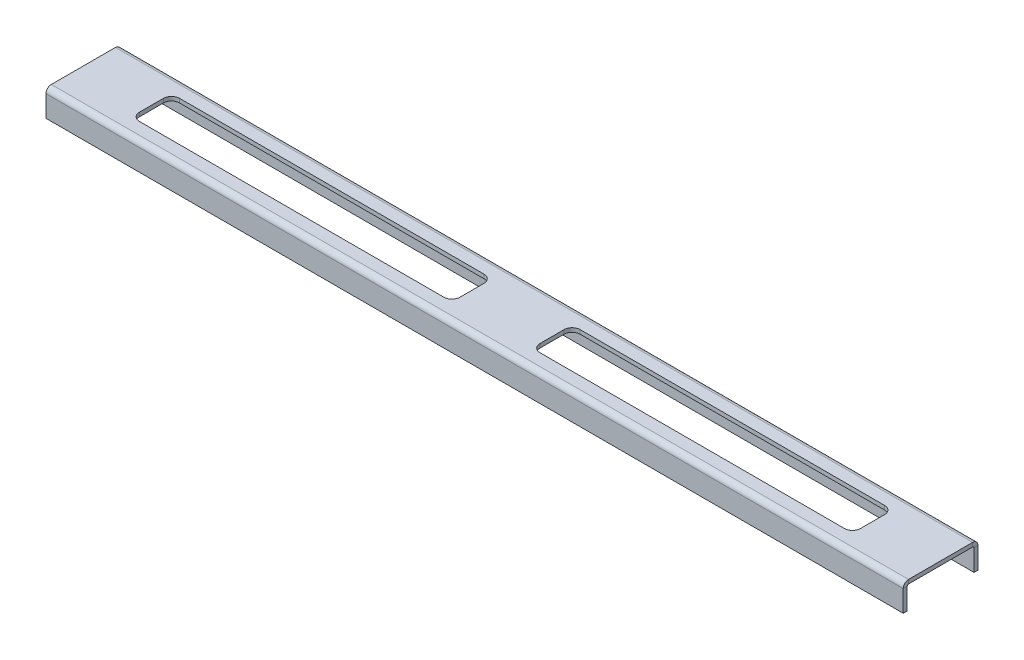
ISO-10303-21;
HEADER;
FILE_DESCRIPTION(('STEP AP214'),'2;1');
FILE_NAME('part.step','',(''),(''),'','','');
FILE_SCHEMA(('AUTOMOTIVE_DESIGN { 1 0 10303 214 1 1 1 1 }'));
ENDSEC;
DATA;
#1=APPLICATION_CONTEXT('core data for automotive mechanical design processes');
#2=APPLICATION_PROTOCOL_DEFINITION('international standard','automotive_design',2000,#1);
#3=PRODUCT_CONTEXT('',#1,'mechanical');
#4=PRODUCT('Part','Part','',(#3));
#5=PRODUCT_RELATED_PRODUCT_CATEGORY('part','',(#4));
#6=PRODUCT_DEFINITION_FORMATION('','',#4);
#7=PRODUCT_DEFINITION_CONTEXT('part definition',#1,'design');
#8=PRODUCT_DEFINITION('design','',#6,#7);
#9=PRODUCT_DEFINITION_SHAPE('','',#8);
#10=(LENGTH_UNIT() NAMED_UNIT(*) SI_UNIT(.MILLI.,.METRE.));
#11=(NAMED_UNIT(*) PLANE_ANGLE_UNIT() SI_UNIT($,.RADIAN.));
#12=(NAMED_UNIT(*) SI_UNIT($,.STERADIAN.) SOLID_ANGLE_UNIT());
#13=UNCERTAINTY_MEASURE_WITH_UNIT(LENGTH_MEASURE(1.E-05),#10,'distance_accuracy_value','');
#14=(GEOMETRIC_REPRESENTATION_CONTEXT(3) GLOBAL_UNCERTAINTY_ASSIGNED_CONTEXT((#13)) GLOBAL_UNIT_ASSIGNED_CONTEXT((#10,
#11,#12)) REPRESENTATION_CONTEXT('',''));
#15=CARTESIAN_POINT('',(0.,0.,0.));
#16=DIRECTION('',(0.,0.,1.));
#17=DIRECTION('',(1.,0.,0.));
#18=AXIS2_PLACEMENT_3D('',#15,#16,#17);
#19=CARTESIAN_POINT('',(0.,30.,-1.11284468464205E-13));
#20=DIRECTION('',(0.,-1.,0.));
#21=DIRECTION('',(0.,0.,-1.));
#22=AXIS2_PLACEMENT_3D('',#19,#20,#21);
#23=PLANE('',#22);
#24=DIRECTION('',(-1.,0.,0.));
#25=VECTOR('',#24,1.);
#26=CARTESIAN_POINT('',(-160.5,30.0000000000001,24.5));
#27=LINE('',#26,#25);
#28=CARTESIAN_POINT('',(-160.5,30.0000000000001,24.5));
#29=VERTEX_POINT('',#28);
#30=CARTESIAN_POINT('',(160.5,30.0000000000001,24.5));
#31=VERTEX_POINT('',#30);
#32=EDGE_CURVE('E472',#29,#31,#27,.F.);
#33=ORIENTED_EDGE('',*,*,#32,.T.);
#34=DIRECTION('',(0.,0.,-1.));
#35=VECTOR('',#34,1.);
#36=CARTESIAN_POINT('',(160.5,30.,-1.11284468464205E-13));
#37=LINE('',#36,#35);
#38=CARTESIAN_POINT('',(160.5,30.,0.499999999999995));
#39=VERTEX_POINT('',#38);
#40=EDGE_CURVE('E495',#31,#39,#37,.T.);
#41=ORIENTED_EDGE('',*,*,#40,.T.);
#42=DIRECTION('',(-1.,0.,0.));
#43=VECTOR('',#42,1.);
#44=CARTESIAN_POINT('',(160.5,30.,0.499999999999992));
#45=LINE('',#44,#43);
#46=CARTESIAN_POINT('',(-160.5,30.,0.499999999999999));
#47=VERTEX_POINT('',#46);
#48=EDGE_CURVE('E505',#47,#39,#45,.F.);
#49=ORIENTED_EDGE('',*,*,#48,.F.);
#50=DIRECTION('',(0.,0.,1.));
#51=VECTOR('',#50,1.);
#52=CARTESIAN_POINT('',(-160.5,30.,-1.11284468464205E-13));
#53=LINE('',#52,#51);
#54=EDGE_CURVE('E498',#47,#29,#53,.T.);
#55=ORIENTED_EDGE('',*,*,#54,.T.);
#56=EDGE_LOOP('',(#33,#41,#49,#55));
#57=FACE_BOUND('',#56,.T.);
#58=DIRECTION('',(-1.,0.,0.));
#59=VECTOR('',#58,1.);
#60=CARTESIAN_POINT('',(-132.,30.,4.99999999999999));
#61=LINE('',#60,#59);
#62=CARTESIAN_POINT('',(-18.,30.,4.99999999999999));
#63=VERTEX_POINT('',#62);
#64=CARTESIAN_POINT('',(-132.,30.,4.99999999999999));
#65=VERTEX_POINT('',#64);
#66=EDGE_CURVE('E385',#63,#65,#61,.T.);
#67=ORIENTED_EDGE('',*,*,#66,.F.);
#68=CARTESIAN_POINT('',(-18.,30.,7.99999999999999));
#69=DIRECTION('',(0.,1.,0.));
#70=DIRECTION('',(0.,0.,-1.));
#71=AXIS2_PLACEMENT_3D('',#68,#69,#70);
#72=CIRCLE('',#71,3.);
#73=CARTESIAN_POINT('',(-15.,30.,8.00000000000002));
#74=VERTEX_POINT('',#73);
#75=EDGE_CURVE('E382',#74,#63,#72,.T.);
#76=ORIENTED_EDGE('',*,*,#75,.F.);
#77=DIRECTION('',(0.,0.,-1.));
#78=VECTOR('',#77,1.);
#79=CARTESIAN_POINT('',(-15.,30.,8.00000000000002));
#80=LINE('',#79,#78);
#81=CARTESIAN_POINT('',(-15.,30.0000000000001,17.));
#82=VERTEX_POINT('',#81);
#83=EDGE_CURVE('E419',#82,#74,#80,.T.);
#84=ORIENTED_EDGE('',*,*,#83,.F.);
#85=CARTESIAN_POINT('',(-18.,30.0000000000001,17.));
#86=DIRECTION('',(0.,1.,0.));
#87=DIRECTION('',(0.,0.,-1.));
#88=AXIS2_PLACEMENT_3D('',#85,#86,#87);
#89=CIRCLE('',#88,3.);
#90=CARTESIAN_POINT('',(-18.,30.0000000000001,20.));
#91=VERTEX_POINT('',#90);
#92=EDGE_CURVE('E416',#91,#82,#89,.T.);
#93=ORIENTED_EDGE('',*,*,#92,.F.);
#94=DIRECTION('',(1.,0.,0.));
#95=VECTOR('',#94,1.);
#96=CARTESIAN_POINT('',(-132.,30.0000000000001,20.));
#97=LINE('',#96,#95);
#98=CARTESIAN_POINT('',(-132.,30.0000000000001,20.));
#99=VERTEX_POINT('',#98);
#100=EDGE_CURVE('E413',#99,#91,#97,.T.);
#101=ORIENTED_EDGE('',*,*,#100,.F.);
#102=CARTESIAN_POINT('',(-132.,30.0000000000001,17.));
#103=DIRECTION('',(0.,1.,0.));
#104=DIRECTION('',(0.,0.,-1.));
#105=AXIS2_PLACEMENT_3D('',#102,#103,#104);
#106=CIRCLE('',#105,3.);
#107=CARTESIAN_POINT('',(-135.,30.0000000000001,17.));
#108=VERTEX_POINT('',#107);
#109=EDGE_CURVE('E410',#108,#99,#106,.T.);
#110=ORIENTED_EDGE('',*,*,#109,.F.);
#111=DIRECTION('',(0.,0.,1.));
#112=VECTOR('',#111,1.);
#113=CARTESIAN_POINT('',(-135.,30.,8.00000000000002));
#114=LINE('',#113,#112);
#115=CARTESIAN_POINT('',(-135.,30.,8.00000000000002));
#116=VERTEX_POINT('',#115);
#117=EDGE_CURVE('E407',#116,#108,#114,.T.);
#118=ORIENTED_EDGE('',*,*,#117,.F.);
#119=CARTESIAN_POINT('',(-132.,30.,7.99999999999999));
#120=DIRECTION('',(0.,1.,0.));
#121=DIRECTION('',(0.,0.,-1.));
#122=AXIS2_PLACEMENT_3D('',#119,#120,#121);
#123=CIRCLE('',#122,3.);
#124=EDGE_CURVE('E404',#65,#116,#123,.T.);
#125=ORIENTED_EDGE('',*,*,#124,.F.);
#126=EDGE_LOOP('',(#67,#76,#84,#93,#101,#110,#118,#125));
#127=FACE_BOUND('',#126,.T.);
#128=CARTESIAN_POINT('',(18.,30.,7.99999999999999));
#129=DIRECTION('',(0.,-1.,0.));
#130=DIRECTION('',(0.,0.,-1.));
#131=AXIS2_PLACEMENT_3D('',#128,#129,#130);
#132=CIRCLE('',#131,3.);
#133=CARTESIAN_POINT('',(15.,30.,8.00000000000002));
#134=VERTEX_POINT('',#133);
#135=CARTESIAN_POINT('',(18.,30.,4.99999999999999));
#136=VERTEX_POINT('',#135);
#137=EDGE_CURVE('E140',#134,#136,#132,.T.);
#138=ORIENTED_EDGE('',*,*,#137,.T.);
#139=DIRECTION('',(1.,0.,0.));
#140=VECTOR('',#139,1.);
#141=CARTESIAN_POINT('',(132.,30.,4.99999999999999));
#142=LINE('',#141,#140);
#143=CARTESIAN_POINT('',(132.,30.,4.99999999999999));
#144=VERTEX_POINT('',#143);
#145=EDGE_CURVE('E381',#136,#144,#142,.T.);
#146=ORIENTED_EDGE('',*,*,#145,.T.);
#147=CARTESIAN_POINT('',(132.,30.,7.99999999999999));
#148=DIRECTION('',(0.,-1.,0.));
#149=DIRECTION('',(0.,0.,-1.));
#150=AXIS2_PLACEMENT_3D('',#147,#148,#149);
#151=CIRCLE('',#150,3.);
#152=CARTESIAN_POINT('',(135.,30.,8.00000000000002));
#153=VERTEX_POINT('',#152);
#154=EDGE_CURVE('E1041',#144,#153,#151,.T.);
#155=ORIENTED_EDGE('',*,*,#154,.T.);
#156=DIRECTION('',(0.,0.,1.));
#157=VECTOR('',#156,1.);
#158=CARTESIAN_POINT('',(135.,30.,8.00000000000002));
#159=LINE('',#158,#157);
#160=CARTESIAN_POINT('',(135.,30.0000000000001,17.));
#161=VERTEX_POINT('',#160);
#162=EDGE_CURVE('E1039',#153,#161,#159,.T.);
#163=ORIENTED_EDGE('',*,*,#162,.T.);
#164=CARTESIAN_POINT('',(132.,30.0000000000001,17.));
#165=DIRECTION('',(0.,-1.,0.));
#166=DIRECTION('',(0.,0.,-1.));
#167=AXIS2_PLACEMENT_3D('',#164,#165,#166);
#168=CIRCLE('',#167,3.);
#169=CARTESIAN_POINT('',(132.,30.0000000000001,20.));
#170=VERTEX_POINT('',#169);
#171=EDGE_CURVE('E1036',#161,#170,#168,.T.);
#172=ORIENTED_EDGE('',*,*,#171,.T.);
#173=DIRECTION('',(-1.,0.,0.));
#174=VECTOR('',#173,1.);
#175=CARTESIAN_POINT('',(132.,30.0000000000001,20.));
#176=LINE('',#175,#174);
#177=CARTESIAN_POINT('',(18.,30.0000000000001,20.));
#178=VERTEX_POINT('',#177);
#179=EDGE_CURVE('E1033',#170,#178,#176,.T.);
#180=ORIENTED_EDGE('',*,*,#179,.T.);
#181=CARTESIAN_POINT('',(18.,30.0000000000001,17.));
#182=DIRECTION('',(0.,-1.,0.));
#183=DIRECTION('',(0.,0.,-1.));
#184=AXIS2_PLACEMENT_3D('',#181,#182,#183);
#185=CIRCLE('',#184,3.);
#186=CARTESIAN_POINT('',(15.,30.0000000000001,17.));
#187=VERTEX_POINT('',#186);
#188=EDGE_CURVE('E1028',#178,#187,#185,.T.);
#189=ORIENTED_EDGE('',*,*,#188,.T.);
#190=DIRECTION('',(0.,0.,-1.));
#191=VECTOR('',#190,1.);
#192=CARTESIAN_POINT('',(15.,30.,8.00000000000002));
#193=LINE('',#192,#191);
#194=EDGE_CURVE('E1026',#187,#134,#193,.T.);
#195=ORIENTED_EDGE('',*,*,#194,.T.);
#196=EDGE_LOOP('',(#138,#146,#155,#163,#172,#180,#189,#195));
#197=FACE_BOUND('',#196,.T.);
#198=ADVANCED_FACE('F118',(#57,#127,#197),#23,.F.);
#199=CARTESIAN_POINT('',(0.,28.5,-1.06047246455941E-13));
#200=DIRECTION('',(0.,-1.,0.));
#201=DIRECTION('',(0.,0.,-1.));
#202=AXIS2_PLACEMENT_3D('',#199,#200,#201);
#203=PLANE('',#202);
#204=CARTESIAN_POINT('',(-18.,28.5,8.));
#205=DIRECTION('',(0.,-1.,0.));
#206=DIRECTION('',(0.,0.,-1.));
#207=AXIS2_PLACEMENT_3D('',#204,#205,#206);
#208=CIRCLE('',#207,3.);
#209=CARTESIAN_POINT('',(-18.,28.5,5.));
#210=VERTEX_POINT('',#209);
#211=CARTESIAN_POINT('',(-15.,28.5,8.00000000000002));
#212=VERTEX_POINT('',#211);
#213=EDGE_CURVE('E347',#210,#212,#208,.T.);
#214=ORIENTED_EDGE('',*,*,#213,.F.);
#215=DIRECTION('',(1.,0.,0.));
#216=VECTOR('',#215,1.);
#217=CARTESIAN_POINT('',(0.,28.5,5.));
#218=LINE('',#217,#216);
#219=CARTESIAN_POINT('',(-132.,28.5,5.));
#220=VERTEX_POINT('',#219);
#221=EDGE_CURVE('E323',#220,#210,#218,.T.);
#222=ORIENTED_EDGE('',*,*,#221,.F.);
#223=CARTESIAN_POINT('',(-132.,28.5,8.));
#224=DIRECTION('',(0.,-1.,0.));
#225=DIRECTION('',(0.,0.,-1.));
#226=AXIS2_PLACEMENT_3D('',#223,#224,#225);
#227=CIRCLE('',#226,3.);
#228=CARTESIAN_POINT('',(-135.,28.5,8.00000000000002));
#229=VERTEX_POINT('',#228);
#230=EDGE_CURVE('E334',#229,#220,#227,.T.);
#231=ORIENTED_EDGE('',*,*,#230,.F.);
#232=DIRECTION('',(0.,0.,-1.));
#233=VECTOR('',#232,1.);
#234=CARTESIAN_POINT('',(-135.,28.5,-1.06047246455941E-13));
#235=LINE('',#234,#233);
#236=CARTESIAN_POINT('',(-135.,28.5,17.));
#237=VERTEX_POINT('',#236);
#238=EDGE_CURVE('E337',#237,#229,#235,.T.);
#239=ORIENTED_EDGE('',*,*,#238,.F.);
#240=CARTESIAN_POINT('',(-132.,28.5000000000001,17.));
#241=DIRECTION('',(0.,-1.,0.));
#242=DIRECTION('',(0.,0.,-1.));
#243=AXIS2_PLACEMENT_3D('',#240,#241,#242);
#244=CIRCLE('',#243,3.);
#245=CARTESIAN_POINT('',(-132.,28.5000000000001,20.));
#246=VERTEX_POINT('',#245);
#247=EDGE_CURVE('E339',#246,#237,#244,.T.);
#248=ORIENTED_EDGE('',*,*,#247,.F.);
#249=DIRECTION('',(-1.,0.,0.));
#250=VECTOR('',#249,1.);
#251=CARTESIAN_POINT('',(0.,28.5000000000001,20.));
#252=LINE('',#251,#250);
#253=CARTESIAN_POINT('',(-18.,28.5000000000001,20.));
#254=VERTEX_POINT('',#253);
#255=EDGE_CURVE('E341',#254,#246,#252,.T.);
#256=ORIENTED_EDGE('',*,*,#255,.F.);
#257=CARTESIAN_POINT('',(-18.,28.5000000000001,17.));
#258=DIRECTION('',(0.,-1.,0.));
#259=DIRECTION('',(0.,0.,-1.));
#260=AXIS2_PLACEMENT_3D('',#257,#258,#259);
#261=CIRCLE('',#260,3.);
#262=CARTESIAN_POINT('',(-15.,28.5000000000001,17.));
#263=VERTEX_POINT('',#262);
#264=EDGE_CURVE('E343',#263,#254,#261,.T.);
#265=ORIENTED_EDGE('',*,*,#264,.F.);
#266=DIRECTION('',(0.,0.,1.));
#267=VECTOR('',#266,1.);
#268=CARTESIAN_POINT('',(-15.,28.5,-1.06047246455941E-13));
#269=LINE('',#268,#267);
#270=EDGE_CURVE('E345',#212,#263,#269,.T.);
#271=ORIENTED_EDGE('',*,*,#270,.F.);
#272=EDGE_LOOP('',(#214,#222,#231,#239,#248,#256,#265,#271));
#273=FACE_BOUND('',#272,.T.);
#274=DIRECTION('',(0.,0.,1.));
#275=VECTOR('',#274,1.);
#276=CARTESIAN_POINT('',(160.5,28.5,0.));
#277=LINE('',#276,#275);
#278=CARTESIAN_POINT('',(160.5,28.5000000000001,24.5));
#279=VERTEX_POINT('',#278);
#280=CARTESIAN_POINT('',(160.5,28.5,0.5));
#281=VERTEX_POINT('',#280);
#282=EDGE_CURVE('E500',#279,#281,#277,.F.);
#283=ORIENTED_EDGE('',*,*,#282,.F.);
#284=DIRECTION('',(-1.,0.,0.));
#285=VECTOR('',#284,1.);
#286=CARTESIAN_POINT('',(-160.5,28.5000000000001,24.5));
#287=LINE('',#286,#285);
#288=CARTESIAN_POINT('',(-160.5,28.5000000000001,24.5));
#289=VERTEX_POINT('',#288);
#290=EDGE_CURVE('E484',#289,#279,#287,.F.);
#291=ORIENTED_EDGE('',*,*,#290,.F.);
#292=DIRECTION('',(0.,0.,-1.));
#293=VECTOR('',#292,1.);
#294=CARTESIAN_POINT('',(-160.5,28.5000000000001,26.5));
#295=LINE('',#294,#293);
#296=CARTESIAN_POINT('',(-160.5,28.5,0.5));
#297=VERTEX_POINT('',#296);
#298=EDGE_CURVE('E502',#297,#289,#295,.F.);
#299=ORIENTED_EDGE('',*,*,#298,.F.);
#300=DIRECTION('',(-1.,0.,0.));
#301=VECTOR('',#300,1.);
#302=CARTESIAN_POINT('',(160.5,28.5,0.499999999999997));
#303=LINE('',#302,#301);
#304=EDGE_CURVE('E511',#281,#297,#303,.T.);
#305=ORIENTED_EDGE('',*,*,#304,.F.);
#306=EDGE_LOOP('',(#283,#291,#299,#305));
#307=FACE_BOUND('',#306,.T.);
#308=DIRECTION('',(-1.,0.,0.));
#309=VECTOR('',#308,1.);
#310=CARTESIAN_POINT('',(0.,28.5,5.));
#311=LINE('',#310,#309);
#312=CARTESIAN_POINT('',(132.,28.5,5.));
#313=VERTEX_POINT('',#312);
#314=CARTESIAN_POINT('',(18.,28.5,5.));
#315=VERTEX_POINT('',#314);
#316=EDGE_CURVE('E367',#313,#315,#311,.T.);
#317=ORIENTED_EDGE('',*,*,#316,.T.);
#318=CARTESIAN_POINT('',(18.,28.5,8.));
#319=DIRECTION('',(0.,-1.,0.));
#320=DIRECTION('',(0.,0.,-1.));
#321=AXIS2_PLACEMENT_3D('',#318,#319,#320);
#322=CIRCLE('',#321,3.);
#323=CARTESIAN_POINT('',(15.,28.5,8.00000000000002));
#324=VERTEX_POINT('',#323);
#325=EDGE_CURVE('E126',#315,#324,#322,.F.);
#326=ORIENTED_EDGE('',*,*,#325,.T.);
#327=DIRECTION('',(0.,0.,1.));
#328=VECTOR('',#327,1.);
#329=CARTESIAN_POINT('',(15.,28.5,-1.06047246455941E-13));
#330=LINE('',#329,#328);
#331=CARTESIAN_POINT('',(15.,28.5000000000001,17.0000000000002));
#332=VERTEX_POINT('',#331);
#333=EDGE_CURVE('E349',#324,#332,#330,.T.);
#334=ORIENTED_EDGE('',*,*,#333,.T.);
#335=CARTESIAN_POINT('',(18.,28.5000000000001,17.));
#336=DIRECTION('',(0.,-1.,0.));
#337=DIRECTION('',(0.,0.,-1.));
#338=AXIS2_PLACEMENT_3D('',#335,#336,#337);
#339=CIRCLE('',#338,3.);
#340=CARTESIAN_POINT('',(18.,28.5,20.));
#341=VERTEX_POINT('',#340);
#342=EDGE_CURVE('E352',#332,#341,#339,.F.);
#343=ORIENTED_EDGE('',*,*,#342,.T.);
#344=DIRECTION('',(1.,0.,0.));
#345=VECTOR('',#344,1.);
#346=CARTESIAN_POINT('',(0.,28.5000000000001,20.));
#347=LINE('',#346,#345);
#348=CARTESIAN_POINT('',(132.,28.5000000000001,20.));
#349=VERTEX_POINT('',#348);
#350=EDGE_CURVE('E355',#341,#349,#347,.T.);
#351=ORIENTED_EDGE('',*,*,#350,.T.);
#352=CARTESIAN_POINT('',(132.,28.5000000000001,17.));
#353=DIRECTION('',(0.,-1.,0.));
#354=DIRECTION('',(0.,0.,-1.));
#355=AXIS2_PLACEMENT_3D('',#352,#353,#354);
#356=CIRCLE('',#355,3.);
#357=CARTESIAN_POINT('',(135.,28.5,17.));
#358=VERTEX_POINT('',#357);
#359=EDGE_CURVE('E358',#349,#358,#356,.F.);
#360=ORIENTED_EDGE('',*,*,#359,.T.);
#361=DIRECTION('',(0.,0.,-1.));
#362=VECTOR('',#361,1.);
#363=CARTESIAN_POINT('',(135.,28.5,-1.06047246455941E-13));
#364=LINE('',#363,#362);
#365=CARTESIAN_POINT('',(135.,28.5,8.00000000000002));
#366=VERTEX_POINT('',#365);
#367=EDGE_CURVE('E361',#358,#366,#364,.T.);
#368=ORIENTED_EDGE('',*,*,#367,.T.);
#369=CARTESIAN_POINT('',(132.,28.5,8.));
#370=DIRECTION('',(0.,-1.,0.));
#371=DIRECTION('',(0.,0.,-1.));
#372=AXIS2_PLACEMENT_3D('',#369,#370,#371);
#373=CIRCLE('',#372,3.);
#374=EDGE_CURVE('E364',#366,#313,#373,.F.);
#375=ORIENTED_EDGE('',*,*,#374,.T.);
#376=EDGE_LOOP('',(#317,#326,#334,#343,#351,#360,#368,#375));
#377=FACE_BOUND('',#376,.T.);
#378=ADVANCED_FACE('F371',(#273,#307,#377),#203,.T.);
#379=CARTESIAN_POINT('',(-160.5,30.0000000000001,26.5));
#380=DIRECTION('',(1.,0.,0.));
#381=DIRECTION('',(0.,0.,-1.));
#382=AXIS2_PLACEMENT_3D('',#379,#380,#381);
#383=PLANE('',#382);
#384=DIRECTION('',(0.,1.,0.));
#385=VECTOR('',#384,1.);
#386=CARTESIAN_POINT('',(-160.5,28.5000000000001,24.5));
#387=LINE('',#386,#385);
#388=EDGE_CURVE('E478',#289,#29,#387,.T.);
#389=ORIENTED_EDGE('',*,*,#388,.T.);
#390=ORIENTED_EDGE('',*,*,#54,.F.);
#391=DIRECTION('',(0.,-1.,0.));
#392=VECTOR('',#391,1.);
#393=CARTESIAN_POINT('',(-160.5,28.5,0.500000000000004));
#394=LINE('',#393,#392);
#395=EDGE_CURVE('E508',#297,#47,#394,.F.);
#396=ORIENTED_EDGE('',*,*,#395,.F.);
#397=ORIENTED_EDGE('',*,*,#298,.T.);
#398=EDGE_LOOP('',(#389,#390,#396,#397));
#399=FACE_BOUND('',#398,.T.);
#400=ADVANCED_FACE('F550',(#399),#383,.F.);
#401=CARTESIAN_POINT('',(160.5,30.,0.));
#402=DIRECTION('',(-1.,0.,0.));
#403=DIRECTION('',(0.,0.,1.));
#404=AXIS2_PLACEMENT_3D('',#401,#402,#403);
#405=PLANE('',#404);
#406=DIRECTION('',(0.,1.,0.));
#407=VECTOR('',#406,1.);
#408=CARTESIAN_POINT('',(160.5,28.5000000000001,24.5));
#409=LINE('',#408,#407);
#410=EDGE_CURVE('E489',#279,#31,#409,.T.);
#411=ORIENTED_EDGE('',*,*,#410,.F.);
#412=ORIENTED_EDGE('',*,*,#282,.T.);
#413=DIRECTION('',(0.,-1.,0.));
#414=VECTOR('',#413,1.);
#415=CARTESIAN_POINT('',(160.5,30.,0.499999999999992));
#416=LINE('',#415,#414);
#417=EDGE_CURVE('E492',#281,#39,#416,.F.);
#418=ORIENTED_EDGE('',*,*,#417,.T.);
#419=ORIENTED_EDGE('',*,*,#40,.F.);
#420=EDGE_LOOP('',(#411,#412,#418,#419));
#421=FACE_BOUND('',#420,.T.);
#422=ADVANCED_FACE('F603',(#421),#405,.F.);
#423=CARTESIAN_POINT('',(0.,0.,-1.5));
#424=DIRECTION('',(0.,0.,1.));
#425=DIRECTION('',(1.,0.,0.));
#426=AXIS2_PLACEMENT_3D('',#423,#424,#425);
#427=PLANE('',#426);
#428=DIRECTION('',(0.,1.,0.));
#429=VECTOR('',#428,1.);
#430=CARTESIAN_POINT('',(160.5,30.,-1.5));
#431=LINE('',#430,#429);
#432=CARTESIAN_POINT('',(160.5,20.0000000000001,-1.5));
#433=VERTEX_POINT('',#432);
#434=CARTESIAN_POINT('',(160.5,28.,-1.5));
#435=VERTEX_POINT('',#434);
#436=EDGE_CURVE('E312',#433,#435,#431,.T.);
#437=ORIENTED_EDGE('',*,*,#436,.F.);
#438=DIRECTION('',(-1.,0.,0.));
#439=VECTOR('',#438,1.);
#440=CARTESIAN_POINT('',(0.,20.0000000000001,-1.5));
#441=LINE('',#440,#439);
#442=CARTESIAN_POINT('',(-160.5,20.0000000000001,-1.5));
#443=VERTEX_POINT('',#442);
#444=EDGE_CURVE('E301',#433,#443,#441,.T.);
#445=ORIENTED_EDGE('',*,*,#444,.T.);
#446=DIRECTION('',(0.,-1.,0.));
#447=VECTOR('',#446,1.);
#448=CARTESIAN_POINT('',(-160.5,30.,-1.5));
#449=LINE('',#448,#447);
#450=CARTESIAN_POINT('',(-160.5,28.,-1.5));
#451=VERTEX_POINT('',#450);
#452=EDGE_CURVE('E320',#451,#443,#449,.T.);
#453=ORIENTED_EDGE('',*,*,#452,.F.);
#454=DIRECTION('',(-1.,0.,0.));
#455=VECTOR('',#454,1.);
#456=CARTESIAN_POINT('',(-160.5,28.,-1.5));
#457=LINE('',#456,#455);
#458=EDGE_CURVE('E318',#451,#435,#457,.F.);
#459=ORIENTED_EDGE('',*,*,#458,.T.);
#460=EDGE_LOOP('',(#437,#445,#453,#459));
#461=FACE_BOUND('',#460,.T.);
#462=ADVANCED_FACE('F316',(#461),#427,.F.);
#463=CARTESIAN_POINT('',(0.,0.,0.));
#464=DIRECTION('',(0.,0.,1.));
#465=DIRECTION('',(1.,0.,0.));
#466=AXIS2_PLACEMENT_3D('',#463,#464,#465);
#467=PLANE('',#466);
#468=DIRECTION('',(-1.,0.,0.));
#469=VECTOR('',#468,1.);
#470=CARTESIAN_POINT('',(0.,20.0000000000001,0.));
#471=LINE('',#470,#469);
#472=CARTESIAN_POINT('',(160.5,20.0000000000001,0.));
#473=VERTEX_POINT('',#472);
#474=CARTESIAN_POINT('',(-160.5,20.0000000000001,0.));
#475=VERTEX_POINT('',#474);
#476=EDGE_CURVE('E132',#473,#475,#471,.T.);
#477=ORIENTED_EDGE('',*,*,#476,.F.);
#478=DIRECTION('',(0.,1.,0.));
#479=VECTOR('',#478,1.);
#480=CARTESIAN_POINT('',(160.5,30.,0.));
#481=LINE('',#480,#479);
#482=CARTESIAN_POINT('',(160.5,28.,0.));
#483=VERTEX_POINT('',#482);
#484=EDGE_CURVE('E314',#473,#483,#481,.T.);
#485=ORIENTED_EDGE('',*,*,#484,.T.);
#486=DIRECTION('',(-1.,0.,0.));
#487=VECTOR('',#486,1.);
#488=CARTESIAN_POINT('',(-160.5,28.,0.));
#489=LINE('',#488,#487);
#490=CARTESIAN_POINT('',(-160.5,28.,0.));
#491=VERTEX_POINT('',#490);
#492=EDGE_CURVE('E525',#491,#483,#489,.F.);
#493=ORIENTED_EDGE('',*,*,#492,.F.);
#494=DIRECTION('',(0.,-1.,0.));
#495=VECTOR('',#494,1.);
#496=CARTESIAN_POINT('',(-160.5,30.,0.));
#497=LINE('',#496,#495);
#498=EDGE_CURVE('E321',#491,#475,#497,.T.);
#499=ORIENTED_EDGE('',*,*,#498,.T.);
#500=EDGE_LOOP('',(#477,#485,#493,#499));
#501=FACE_BOUND('',#500,.T.);
#502=ADVANCED_FACE('F622',(#501),#467,.T.);
#503=CARTESIAN_POINT('',(160.5,30.,-1.5));
#504=DIRECTION('',(1.,0.,0.));
#505=DIRECTION('',(0.,0.,-1.));
#506=AXIS2_PLACEMENT_3D('',#503,#504,#505);
#507=PLANE('',#506);
#508=DIRECTION('',(0.,0.,1.));
#509=VECTOR('',#508,1.);
#510=CARTESIAN_POINT('',(160.5,20.0000000000001,-10.));
#511=LINE('',#510,#509);
#512=EDGE_CURVE('E304',#433,#473,#511,.T.);
#513=ORIENTED_EDGE('',*,*,#512,.F.);
#514=ORIENTED_EDGE('',*,*,#436,.T.);
#515=DIRECTION('',(0.,0.,-1.));
#516=VECTOR('',#515,1.);
#517=CARTESIAN_POINT('',(160.5,28.,0.));
#518=LINE('',#517,#516);
#519=EDGE_CURVE('E331',#483,#435,#518,.T.);
#520=ORIENTED_EDGE('',*,*,#519,.F.);
#521=ORIENTED_EDGE('',*,*,#484,.F.);
#522=EDGE_LOOP('',(#513,#514,#520,#521));
#523=FACE_BOUND('',#522,.T.);
#524=ADVANCED_FACE('F120',(#523),#507,.T.);
#525=CARTESIAN_POINT('',(-160.5,30.,-1.5));
#526=DIRECTION('',(-1.,0.,0.));
#527=DIRECTION('',(0.,0.,1.));
#528=AXIS2_PLACEMENT_3D('',#525,#526,#527);
#529=PLANE('',#528);
#530=DIRECTION('',(0.,0.,-1.));
#531=VECTOR('',#530,1.);
#532=CARTESIAN_POINT('',(-160.5,20.0000000000001,-1.5));
#533=LINE('',#532,#531);
#534=EDGE_CURVE('E13',#475,#443,#533,.T.);
#535=ORIENTED_EDGE('',*,*,#534,.F.);
#536=ORIENTED_EDGE('',*,*,#498,.F.);
#537=DIRECTION('',(0.,0.,-1.));
#538=VECTOR('',#537,1.);
#539=CARTESIAN_POINT('',(-160.5,28.,0.));
#540=LINE('',#539,#538);
#541=EDGE_CURVE('E328',#491,#451,#540,.T.);
#542=ORIENTED_EDGE('',*,*,#541,.T.);
#543=ORIENTED_EDGE('',*,*,#452,.T.);
#544=EDGE_LOOP('',(#535,#536,#542,#543));
#545=FACE_BOUND('',#544,.T.);
#546=ADVANCED_FACE('F536',(#545),#529,.T.);
#547=CARTESIAN_POINT('',(160.5,28.,0.500000000000002));
#548=DIRECTION('',(1.,0.,0.));
#549=DIRECTION('',(0.,0.,-1.));
#550=AXIS2_PLACEMENT_3D('',#547,#548,#549);
#551=PLANE('',#550);
#552=ORIENTED_EDGE('',*,*,#417,.F.);
#553=CARTESIAN_POINT('',(160.5,28.,0.500000000000002));
#554=DIRECTION('',(-1.,0.,0.));
#555=DIRECTION('',(0.,0.,1.));
#556=AXIS2_PLACEMENT_3D('',#553,#554,#555);
#557=CIRCLE('',#556,0.5);
#558=EDGE_CURVE('E522',#483,#281,#557,.F.);
#559=ORIENTED_EDGE('',*,*,#558,.F.);
#560=ORIENTED_EDGE('',*,*,#519,.T.);
#561=CARTESIAN_POINT('',(160.5,28.,0.500000000000002));
#562=DIRECTION('',(-1.,0.,0.));
#563=DIRECTION('',(0.,0.,1.));
#564=AXIS2_PLACEMENT_3D('',#561,#562,#563);
#565=CIRCLE('',#564,2.);
#566=EDGE_CURVE('E516',#435,#39,#565,.F.);
#567=ORIENTED_EDGE('',*,*,#566,.T.);
#568=EDGE_LOOP('',(#552,#559,#560,#567));
#569=FACE_BOUND('',#568,.T.);
#570=ADVANCED_FACE('F615',(#569),#551,.T.);
#571=CARTESIAN_POINT('',(-160.5,28.,0.500000000000002));
#572=DIRECTION('',(1.,0.,0.));
#573=DIRECTION('',(0.,0.,-1.));
#574=AXIS2_PLACEMENT_3D('',#571,#572,#573);
#575=PLANE('',#574);
#576=CARTESIAN_POINT('',(-160.5,28.,0.500000000000002));
#577=DIRECTION('',(-1.,0.,0.));
#578=DIRECTION('',(0.,0.,1.));
#579=AXIS2_PLACEMENT_3D('',#576,#577,#578);
#580=CIRCLE('',#579,0.5);
#581=EDGE_CURVE('E497',#297,#491,#580,.T.);
#582=ORIENTED_EDGE('',*,*,#581,.F.);
#583=ORIENTED_EDGE('',*,*,#395,.T.);
#584=CARTESIAN_POINT('',(-160.5,28.,0.500000000000002));
#585=DIRECTION('',(-1.,0.,0.));
#586=DIRECTION('',(0.,0.,1.));
#587=AXIS2_PLACEMENT_3D('',#584,#585,#586);
#588=CIRCLE('',#587,2.);
#589=EDGE_CURVE('E517',#47,#451,#588,.T.);
#590=ORIENTED_EDGE('',*,*,#589,.T.);
#591=ORIENTED_EDGE('',*,*,#541,.F.);
#592=EDGE_LOOP('',(#582,#583,#590,#591));
#593=FACE_BOUND('',#592,.T.);
#594=ADVANCED_FACE('F541',(#593),#575,.F.);
#595=CARTESIAN_POINT('',(-160.5,28.,0.500000000000002));
#596=DIRECTION('',(-1.,0.,0.));
#597=DIRECTION('',(0.,1.,0.));
#598=AXIS2_PLACEMENT_3D('',#595,#596,#597);
#599=CYLINDRICAL_SURFACE('',#598,2.);
#600=ORIENTED_EDGE('',*,*,#458,.F.);
#601=ORIENTED_EDGE('',*,*,#589,.F.);
#602=ORIENTED_EDGE('',*,*,#48,.T.);
#603=ORIENTED_EDGE('',*,*,#566,.F.);
#604=EDGE_LOOP('',(#600,#601,#602,#603));
#605=FACE_BOUND('',#604,.T.);
#606=ADVANCED_FACE('F540',(#605),#599,.T.);
#607=CARTESIAN_POINT('',(-160.5,28.,0.500000000000002));
#608=DIRECTION('',(-1.,0.,0.));
#609=DIRECTION('',(0.,1.,0.));
#610=AXIS2_PLACEMENT_3D('',#607,#608,#609);
#611=CYLINDRICAL_SURFACE('',#610,0.5);
#612=ORIENTED_EDGE('',*,*,#492,.T.);
#613=ORIENTED_EDGE('',*,*,#558,.T.);
#614=ORIENTED_EDGE('',*,*,#304,.T.);
#615=ORIENTED_EDGE('',*,*,#581,.T.);
#616=EDGE_LOOP('',(#612,#613,#614,#615));
#617=FACE_BOUND('',#616,.T.);
#618=ADVANCED_FACE('F611',(#617),#611,.F.);
#619=CARTESIAN_POINT('',(160.5,28.0000000000001,24.5));
#620=DIRECTION('',(1.,0.,0.));
#621=DIRECTION('',(0.,0.,-1.));
#622=AXIS2_PLACEMENT_3D('',#619,#620,#621);
#623=PLANE('',#622);
#624=DIRECTION('',(0.,0.,1.));
#625=VECTOR('',#624,1.);
#626=CARTESIAN_POINT('',(160.5,28.0000000000001,26.5000000000001));
#627=LINE('',#626,#625);
#628=CARTESIAN_POINT('',(160.5,28.0000000000001,25.));
#629=VERTEX_POINT('',#628);
#630=CARTESIAN_POINT('',(160.5,28.0000000000001,26.5));
#631=VERTEX_POINT('',#630);
#632=EDGE_CURVE('E425',#629,#631,#627,.T.);
#633=ORIENTED_EDGE('',*,*,#632,.F.);
#634=CARTESIAN_POINT('',(160.5,28.0000000000001,24.5));
#635=DIRECTION('',(-1.,0.,0.));
#636=DIRECTION('',(0.,0.,1.));
#637=AXIS2_PLACEMENT_3D('',#634,#635,#636);
#638=CIRCLE('',#637,0.5);
#639=EDGE_CURVE('E481',#279,#629,#638,.F.);
#640=ORIENTED_EDGE('',*,*,#639,.F.);
#641=ORIENTED_EDGE('',*,*,#410,.T.);
#642=CARTESIAN_POINT('',(160.5,28.0000000000001,24.5));
#643=DIRECTION('',(-1.,0.,0.));
#644=DIRECTION('',(0.,0.,1.));
#645=AXIS2_PLACEMENT_3D('',#642,#643,#644);
#646=CIRCLE('',#645,2.);
#647=EDGE_CURVE('E474',#31,#631,#646,.F.);
#648=ORIENTED_EDGE('',*,*,#647,.T.);
#649=EDGE_LOOP('',(#633,#640,#641,#648));
#650=FACE_BOUND('',#649,.T.);
#651=ADVANCED_FACE('F577',(#650),#623,.T.);
#652=CARTESIAN_POINT('',(-160.5,28.0000000000001,24.5));
#653=DIRECTION('',(1.,0.,0.));
#654=DIRECTION('',(0.,0.,-1.));
#655=AXIS2_PLACEMENT_3D('',#652,#653,#654);
#656=PLANE('',#655);
#657=CARTESIAN_POINT('',(-160.5,28.0000000000001,24.5));
#658=DIRECTION('',(-1.,0.,0.));
#659=DIRECTION('',(0.,0.,1.));
#660=AXIS2_PLACEMENT_3D('',#657,#658,#659);
#661=CIRCLE('',#660,0.5);
#662=CARTESIAN_POINT('',(-160.5,28.0000000000001,25.));
#663=VERTEX_POINT('',#662);
#664=EDGE_CURVE('E442',#663,#289,#661,.T.);
#665=ORIENTED_EDGE('',*,*,#664,.F.);
#666=DIRECTION('',(0.,0.,1.));
#667=VECTOR('',#666,1.);
#668=CARTESIAN_POINT('',(-160.5,28.0000000000001,25.));
#669=LINE('',#668,#667);
#670=CARTESIAN_POINT('',(-160.5,28.0000000000001,26.5));
#671=VERTEX_POINT('',#670);
#672=EDGE_CURVE('E465',#663,#671,#669,.T.);
#673=ORIENTED_EDGE('',*,*,#672,.T.);
#674=CARTESIAN_POINT('',(-160.5,28.0000000000001,24.5));
#675=DIRECTION('',(-1.,0.,0.));
#676=DIRECTION('',(0.,0.,1.));
#677=AXIS2_PLACEMENT_3D('',#674,#675,#676);
#678=CIRCLE('',#677,2.);
#679=EDGE_CURVE('E475',#671,#29,#678,.T.);
#680=ORIENTED_EDGE('',*,*,#679,.T.);
#681=ORIENTED_EDGE('',*,*,#388,.F.);
#682=EDGE_LOOP('',(#665,#673,#680,#681));
#683=FACE_BOUND('',#682,.T.);
#684=ADVANCED_FACE('F558',(#683),#656,.F.);
#685=CARTESIAN_POINT('',(-160.5,28.0000000000001,24.5));
#686=DIRECTION('',(-1.,0.,0.));
#687=DIRECTION('',(0.,0.,1.));
#688=AXIS2_PLACEMENT_3D('',#685,#686,#687);
#689=CYLINDRICAL_SURFACE('',#688,2.);
#690=ORIENTED_EDGE('',*,*,#32,.F.);
#691=ORIENTED_EDGE('',*,*,#679,.F.);
#692=DIRECTION('',(-1.,0.,0.));
#693=VECTOR('',#692,1.);
#694=CARTESIAN_POINT('',(0.,28.0000000000001,26.5));
#695=LINE('',#694,#693);
#696=EDGE_CURVE('E462',#631,#671,#695,.T.);
#697=ORIENTED_EDGE('',*,*,#696,.F.);
#698=ORIENTED_EDGE('',*,*,#647,.F.);
#699=EDGE_LOOP('',(#690,#691,#697,#698));
#700=FACE_BOUND('',#699,.T.);
#701=ADVANCED_FACE('F557',(#700),#689,.T.);
#702=CARTESIAN_POINT('',(-160.5,28.0000000000001,24.5));
#703=DIRECTION('',(-1.,0.,0.));
#704=DIRECTION('',(0.,0.,1.));
#705=AXIS2_PLACEMENT_3D('',#702,#703,#704);
#706=CYLINDRICAL_SURFACE('',#705,0.5);
#707=ORIENTED_EDGE('',*,*,#290,.T.);
#708=ORIENTED_EDGE('',*,*,#639,.T.);
#709=DIRECTION('',(1.,0.,0.));
#710=VECTOR('',#709,1.);
#711=CARTESIAN_POINT('',(160.5,28.0000000000001,25.));
#712=LINE('',#711,#710);
#713=EDGE_CURVE('E468',#629,#663,#712,.F.);
#714=ORIENTED_EDGE('',*,*,#713,.T.);
#715=ORIENTED_EDGE('',*,*,#664,.T.);
#716=EDGE_LOOP('',(#707,#708,#714,#715));
#717=FACE_BOUND('',#716,.T.);
#718=ADVANCED_FACE('F580',(#717),#706,.F.);
#719=CARTESIAN_POINT('',(-160.5,28.5000000000001,26.5));
#720=DIRECTION('',(-1.,0.,0.));
#721=DIRECTION('',(0.,0.,1.));
#722=AXIS2_PLACEMENT_3D('',#719,#720,#721);
#723=PLANE('',#722);
#724=DIRECTION('',(0.,1.,0.));
#725=VECTOR('',#724,1.);
#726=CARTESIAN_POINT('',(-160.5,28.5000000000001,26.5));
#727=LINE('',#726,#725);
#728=CARTESIAN_POINT('',(-160.5,20.0000000000001,26.5000000000001));
#729=VERTEX_POINT('',#728);
#730=EDGE_CURVE('E446',#729,#671,#727,.T.);
#731=ORIENTED_EDGE('',*,*,#730,.T.);
#732=ORIENTED_EDGE('',*,*,#672,.F.);
#733=DIRECTION('',(0.,-1.,0.));
#734=VECTOR('',#733,1.);
#735=CARTESIAN_POINT('',(-160.5,1.78578326130746E-13,25.0000000000002));
#736=LINE('',#735,#734);
#737=CARTESIAN_POINT('',(-160.5,20.0000000000001,25.0000000000001));
#738=VERTEX_POINT('',#737);
#739=EDGE_CURVE('E454',#738,#663,#736,.F.);
#740=ORIENTED_EDGE('',*,*,#739,.F.);
#741=DIRECTION('',(0.,0.,-1.));
#742=VECTOR('',#741,1.);
#743=CARTESIAN_POINT('',(-160.5,20.0000000000001,26.5000000000001));
#744=LINE('',#743,#742);
#745=EDGE_CURVE('E440',#729,#738,#744,.T.);
#746=ORIENTED_EDGE('',*,*,#745,.F.);
#747=EDGE_LOOP('',(#731,#732,#740,#746));
#748=FACE_BOUND('',#747,.T.);
#749=ADVANCED_FACE('F567',(#748),#723,.T.);
#750=CARTESIAN_POINT('',(160.5,20.0000000000001,26.5000000000001));
#751=DIRECTION('',(1.,0.,0.));
#752=DIRECTION('',(0.,0.,-1.));
#753=AXIS2_PLACEMENT_3D('',#750,#751,#752);
#754=PLANE('',#753);
#755=DIRECTION('',(0.,1.,0.));
#756=VECTOR('',#755,1.);
#757=CARTESIAN_POINT('',(160.5,1.78578326130746E-13,25.0000000000002));
#758=LINE('',#757,#756);
#759=CARTESIAN_POINT('',(160.5,20.0000000000001,25.0000000000001));
#760=VERTEX_POINT('',#759);
#761=EDGE_CURVE('E460',#629,#760,#758,.F.);
#762=ORIENTED_EDGE('',*,*,#761,.F.);
#763=ORIENTED_EDGE('',*,*,#632,.T.);
#764=DIRECTION('',(0.,-1.,0.));
#765=VECTOR('',#764,1.);
#766=CARTESIAN_POINT('',(160.5,20.0000000000001,26.5000000000001));
#767=LINE('',#766,#765);
#768=CARTESIAN_POINT('',(160.5,20.0000000000001,26.5000000000001));
#769=VERTEX_POINT('',#768);
#770=EDGE_CURVE('E452',#631,#769,#767,.T.);
#771=ORIENTED_EDGE('',*,*,#770,.T.);
#772=DIRECTION('',(0.,0.,-1.));
#773=VECTOR('',#772,1.);
#774=CARTESIAN_POINT('',(160.5,20.0000000000001,26.5000000000001));
#775=LINE('',#774,#773);
#776=EDGE_CURVE('E443',#769,#760,#775,.T.);
#777=ORIENTED_EDGE('',*,*,#776,.T.);
#778=EDGE_LOOP('',(#762,#763,#771,#777));
#779=FACE_BOUND('',#778,.T.);
#780=ADVANCED_FACE('F574',(#779),#754,.T.);
#781=CARTESIAN_POINT('',(0.,1.89117910461808E-13,26.5000000000002));
#782=DIRECTION('',(0.,0.,1.));
#783=DIRECTION('',(0.,-1.,0.));
#784=AXIS2_PLACEMENT_3D('',#781,#782,#783);
#785=PLANE('',#784);
#786=ORIENTED_EDGE('',*,*,#770,.F.);
#787=ORIENTED_EDGE('',*,*,#696,.T.);
#788=ORIENTED_EDGE('',*,*,#730,.F.);
#789=DIRECTION('',(-1.,0.,0.));
#790=VECTOR('',#789,1.);
#791=CARTESIAN_POINT('',(-160.5,20.0000000000001,26.5000000000001));
#792=LINE('',#791,#790);
#793=EDGE_CURVE('E449',#769,#729,#792,.T.);
#794=ORIENTED_EDGE('',*,*,#793,.F.);
#795=EDGE_LOOP('',(#786,#787,#788,#794));
#796=FACE_BOUND('',#795,.T.);
#797=ADVANCED_FACE('F565',(#796),#785,.T.);
#798=CARTESIAN_POINT('',(0.,1.78578326130746E-13,25.0000000000002));
#799=DIRECTION('',(0.,0.,1.));
#800=DIRECTION('',(0.,-1.,0.));
#801=AXIS2_PLACEMENT_3D('',#798,#799,#800);
#802=PLANE('',#801);
#803=ORIENTED_EDGE('',*,*,#713,.F.);
#804=ORIENTED_EDGE('',*,*,#761,.T.);
#805=DIRECTION('',(1.,0.,0.));
#806=VECTOR('',#805,1.);
#807=CARTESIAN_POINT('',(0.,20.0000000000001,25.0000000000001));
#808=LINE('',#807,#806);
#809=EDGE_CURVE('E457',#760,#738,#808,.F.);
#810=ORIENTED_EDGE('',*,*,#809,.T.);
#811=ORIENTED_EDGE('',*,*,#739,.T.);
#812=EDGE_LOOP('',(#803,#804,#810,#811));
#813=FACE_BOUND('',#812,.T.);
#814=ADVANCED_FACE('F582',(#813),#802,.F.);
#815=CARTESIAN_POINT('',(-160.5,20.0000000000001,26.5000000000001));
#816=DIRECTION('',(0.,-1.,0.));
#817=DIRECTION('',(0.,0.,-1.));
#818=AXIS2_PLACEMENT_3D('',#815,#816,#817);
#819=PLANE('',#818);
#820=ORIENTED_EDGE('',*,*,#809,.F.);
#821=ORIENTED_EDGE('',*,*,#776,.F.);
#822=ORIENTED_EDGE('',*,*,#793,.T.);
#823=ORIENTED_EDGE('',*,*,#745,.T.);
#824=EDGE_LOOP('',(#820,#821,#822,#823));
#825=FACE_BOUND('',#824,.T.);
#826=ADVANCED_FACE('F571',(#825),#819,.T.);
#827=CARTESIAN_POINT('',(-132.,-30.0000000000002,5.00000000000021));
#828=DIRECTION('',(0.,0.,-1.));
#829=DIRECTION('',(0.,1.,0.));
#830=AXIS2_PLACEMENT_3D('',#827,#828,#829);
#831=PLANE('',#830);
#832=ORIENTED_EDGE('',*,*,#221,.T.);
#833=DIRECTION('',(0.,1.,0.));
#834=VECTOR('',#833,1.);
#835=CARTESIAN_POINT('',(-18.,-30.0000000000002,5.00000000000021));
#836=LINE('',#835,#834);
#837=EDGE_CURVE('E422',#210,#63,#836,.T.);
#838=ORIENTED_EDGE('',*,*,#837,.T.);
#839=ORIENTED_EDGE('',*,*,#66,.T.);
#840=DIRECTION('',(0.,1.,0.));
#841=VECTOR('',#840,1.);
#842=CARTESIAN_POINT('',(-132.,-30.0000000000002,5.00000000000021));
#843=LINE('',#842,#841);
#844=EDGE_CURVE('E436',#220,#65,#843,.T.);
#845=ORIENTED_EDGE('',*,*,#844,.F.);
#846=EDGE_LOOP('',(#832,#838,#839,#845));
#847=FACE_BOUND('',#846,.T.);
#848=ADVANCED_FACE('F589',(#847),#831,.F.);
#849=CARTESIAN_POINT('',(-132.,-30.0000000000002,8.00000000000021));
#850=DIRECTION('',(0.,1.,0.));
#851=DIRECTION('',(0.,0.,1.));
#852=AXIS2_PLACEMENT_3D('',#849,#850,#851);
#853=CYLINDRICAL_SURFACE('',#852,3.);
#854=ORIENTED_EDGE('',*,*,#230,.T.);
#855=ORIENTED_EDGE('',*,*,#844,.T.);
#856=ORIENTED_EDGE('',*,*,#124,.T.);
#857=DIRECTION('',(0.,1.,0.));
#858=VECTOR('',#857,1.);
#859=CARTESIAN_POINT('',(-135.,-30.0000000000002,8.00000000000023));
#860=LINE('',#859,#858);
#861=EDGE_CURVE('E434',#229,#116,#860,.T.);
#862=ORIENTED_EDGE('',*,*,#861,.F.);
#863=EDGE_LOOP('',(#854,#855,#856,#862));
#864=FACE_BOUND('',#863,.T.);
#865=ADVANCED_FACE('F872',(#864),#853,.F.);
#866=CARTESIAN_POINT('',(-135.,-30.0000000000002,8.00000000000023));
#867=DIRECTION('',(-1.,0.,0.));
#868=DIRECTION('',(0.,0.,1.));
#869=AXIS2_PLACEMENT_3D('',#866,#867,#868);
#870=PLANE('',#869);
#871=ORIENTED_EDGE('',*,*,#238,.T.);
#872=ORIENTED_EDGE('',*,*,#861,.T.);
#873=ORIENTED_EDGE('',*,*,#117,.T.);
#874=DIRECTION('',(0.,1.,0.));
#875=VECTOR('',#874,1.);
#876=CARTESIAN_POINT('',(-135.,-30.0000000000001,17.0000000000002));
#877=LINE('',#876,#875);
#878=EDGE_CURVE('E432',#237,#108,#877,.T.);
#879=ORIENTED_EDGE('',*,*,#878,.F.);
#880=EDGE_LOOP('',(#871,#872,#873,#879));
#881=FACE_BOUND('',#880,.T.);
#882=ADVANCED_FACE('F882',(#881),#870,.F.);
#883=CARTESIAN_POINT('',(-132.,-30.0000000000001,17.0000000000002));
#884=DIRECTION('',(0.,1.,0.));
#885=DIRECTION('',(0.,0.,1.));
#886=AXIS2_PLACEMENT_3D('',#883,#884,#885);
#887=CYLINDRICAL_SURFACE('',#886,3.);
#888=ORIENTED_EDGE('',*,*,#247,.T.);
#889=ORIENTED_EDGE('',*,*,#878,.T.);
#890=ORIENTED_EDGE('',*,*,#109,.T.);
#891=DIRECTION('',(0.,1.,0.));
#892=VECTOR('',#891,1.);
#893=CARTESIAN_POINT('',(-132.,-30.0000000000001,20.0000000000002));
#894=LINE('',#893,#892);
#895=EDGE_CURVE('E430',#246,#99,#894,.T.);
#896=ORIENTED_EDGE('',*,*,#895,.F.);
#897=EDGE_LOOP('',(#888,#889,#890,#896));
#898=FACE_BOUND('',#897,.T.);
#899=ADVANCED_FACE('F892',(#898),#887,.F.);
#900=CARTESIAN_POINT('',(-132.,-30.0000000000001,20.0000000000002));
#901=DIRECTION('',(0.,0.,1.));
#902=DIRECTION('',(0.,-1.,0.));
#903=AXIS2_PLACEMENT_3D('',#900,#901,#902);
#904=PLANE('',#903);
#905=ORIENTED_EDGE('',*,*,#255,.T.);
#906=ORIENTED_EDGE('',*,*,#895,.T.);
#907=ORIENTED_EDGE('',*,*,#100,.T.);
#908=DIRECTION('',(0.,1.,0.));
#909=VECTOR('',#908,1.);
#910=CARTESIAN_POINT('',(-18.,-30.0000000000001,20.0000000000002));
#911=LINE('',#910,#909);
#912=EDGE_CURVE('E428',#254,#91,#911,.T.);
#913=ORIENTED_EDGE('',*,*,#912,.F.);
#914=EDGE_LOOP('',(#905,#906,#907,#913));
#915=FACE_BOUND('',#914,.T.);
#916=ADVANCED_FACE('F902',(#915),#904,.F.);
#917=CARTESIAN_POINT('',(-18.,-30.0000000000001,17.0000000000002));
#918=DIRECTION('',(0.,1.,0.));
#919=DIRECTION('',(0.,0.,1.));
#920=AXIS2_PLACEMENT_3D('',#917,#918,#919);
#921=CYLINDRICAL_SURFACE('',#920,3.);
#922=ORIENTED_EDGE('',*,*,#264,.T.);
#923=ORIENTED_EDGE('',*,*,#912,.T.);
#924=ORIENTED_EDGE('',*,*,#92,.T.);
#925=DIRECTION('',(0.,1.,0.));
#926=VECTOR('',#925,1.);
#927=CARTESIAN_POINT('',(-15.,-30.0000000000001,17.0000000000002));
#928=LINE('',#927,#926);
#929=EDGE_CURVE('E426',#263,#82,#928,.T.);
#930=ORIENTED_EDGE('',*,*,#929,.F.);
#931=EDGE_LOOP('',(#922,#923,#924,#930));
#932=FACE_BOUND('',#931,.T.);
#933=ADVANCED_FACE('F912',(#932),#921,.F.);
#934=CARTESIAN_POINT('',(-15.,-30.0000000000002,8.00000000000023));
#935=DIRECTION('',(1.,0.,0.));
#936=DIRECTION('',(0.,0.,-1.));
#937=AXIS2_PLACEMENT_3D('',#934,#935,#936);
#938=PLANE('',#937);
#939=ORIENTED_EDGE('',*,*,#270,.T.);
#940=ORIENTED_EDGE('',*,*,#929,.T.);
#941=ORIENTED_EDGE('',*,*,#83,.T.);
#942=DIRECTION('',(0.,1.,0.));
#943=VECTOR('',#942,1.);
#944=CARTESIAN_POINT('',(-15.,-30.0000000000002,8.00000000000023));
#945=LINE('',#944,#943);
#946=EDGE_CURVE('E423',#212,#74,#945,.T.);
#947=ORIENTED_EDGE('',*,*,#946,.F.);
#948=EDGE_LOOP('',(#939,#940,#941,#947));
#949=FACE_BOUND('',#948,.T.);
#950=ADVANCED_FACE('F922',(#949),#938,.F.);
#951=CARTESIAN_POINT('',(-18.,-30.0000000000002,8.00000000000021));
#952=DIRECTION('',(0.,1.,0.));
#953=DIRECTION('',(0.,0.,1.));
#954=AXIS2_PLACEMENT_3D('',#951,#952,#953);
#955=CYLINDRICAL_SURFACE('',#954,3.);
#956=ORIENTED_EDGE('',*,*,#213,.T.);
#957=ORIENTED_EDGE('',*,*,#946,.T.);
#958=ORIENTED_EDGE('',*,*,#75,.T.);
#959=ORIENTED_EDGE('',*,*,#837,.F.);
#960=EDGE_LOOP('',(#956,#957,#958,#959));
#961=FACE_BOUND('',#960,.T.);
#962=ADVANCED_FACE('F670',(#961),#955,.F.);
#963=CARTESIAN_POINT('',(15.,-30.0000000000002,8.00000000000023));
#964=DIRECTION('',(1.,0.,0.));
#965=DIRECTION('',(0.,0.,-1.));
#966=AXIS2_PLACEMENT_3D('',#963,#964,#965);
#967=PLANE('',#966);
#968=DIRECTION('',(0.,1.,0.));
#969=VECTOR('',#968,1.);
#970=CARTESIAN_POINT('',(15.,-30.0000000000002,8.00000000000023));
#971=LINE('',#970,#969);
#972=EDGE_CURVE('E376',#324,#134,#971,.T.);
#973=ORIENTED_EDGE('',*,*,#972,.T.);
#974=ORIENTED_EDGE('',*,*,#194,.F.);
#975=DIRECTION('',(0.,1.,0.));
#976=VECTOR('',#975,1.);
#977=CARTESIAN_POINT('',(15.,-30.0000000000002,17.0000000000002));
#978=LINE('',#977,#976);
#979=EDGE_CURVE('E399',#332,#187,#978,.T.);
#980=ORIENTED_EDGE('',*,*,#979,.F.);
#981=ORIENTED_EDGE('',*,*,#333,.F.);
#982=EDGE_LOOP('',(#973,#974,#980,#981));
#983=FACE_BOUND('',#982,.T.);
#984=ADVANCED_FACE('F664',(#983),#967,.T.);
#985=CARTESIAN_POINT('',(18.,-30.0000000000002,17.0000000000002));
#986=DIRECTION('',(0.,1.,0.));
#987=DIRECTION('',(0.,0.,1.));
#988=AXIS2_PLACEMENT_3D('',#985,#986,#987);
#989=CYLINDRICAL_SURFACE('',#988,3.);
#990=ORIENTED_EDGE('',*,*,#979,.T.);
#991=ORIENTED_EDGE('',*,*,#188,.F.);
#992=DIRECTION('',(0.,1.,0.));
#993=VECTOR('',#992,1.);
#994=CARTESIAN_POINT('',(18.,-30.0000000000002,20.0000000000002));
#995=LINE('',#994,#993);
#996=EDGE_CURVE('E397',#341,#178,#995,.T.);
#997=ORIENTED_EDGE('',*,*,#996,.F.);
#998=ORIENTED_EDGE('',*,*,#342,.F.);
#999=EDGE_LOOP('',(#990,#991,#997,#998));
#1000=FACE_BOUND('',#999,.T.);
#1001=ADVANCED_FACE('F669',(#1000),#989,.F.);
#1002=CARTESIAN_POINT('',(132.,-30.0000000000002,20.0000000000002));
#1003=DIRECTION('',(0.,0.,-1.));
#1004=DIRECTION('',(0.,1.,0.));
#1005=AXIS2_PLACEMENT_3D('',#1002,#1003,#1004);
#1006=PLANE('',#1005);
#1007=ORIENTED_EDGE('',*,*,#996,.T.);
#1008=ORIENTED_EDGE('',*,*,#179,.F.);
#1009=DIRECTION('',(0.,1.,0.));
#1010=VECTOR('',#1009,1.);
#1011=CARTESIAN_POINT('',(132.,-30.0000000000002,20.0000000000002));
#1012=LINE('',#1011,#1010);
#1013=EDGE_CURVE('E395',#349,#170,#1012,.T.);
#1014=ORIENTED_EDGE('',*,*,#1013,.F.);
#1015=ORIENTED_EDGE('',*,*,#350,.F.);
#1016=EDGE_LOOP('',(#1007,#1008,#1014,#1015));
#1017=FACE_BOUND('',#1016,.T.);
#1018=ADVANCED_FACE('F682',(#1017),#1006,.T.);
#1019=CARTESIAN_POINT('',(132.,-30.0000000000002,17.0000000000002));
#1020=DIRECTION('',(0.,1.,0.));
#1021=DIRECTION('',(0.,0.,1.));
#1022=AXIS2_PLACEMENT_3D('',#1019,#1020,#1021);
#1023=CYLINDRICAL_SURFACE('',#1022,3.);
#1024=ORIENTED_EDGE('',*,*,#1013,.T.);
#1025=ORIENTED_EDGE('',*,*,#171,.F.);
#1026=DIRECTION('',(0.,1.,0.));
#1027=VECTOR('',#1026,1.);
#1028=CARTESIAN_POINT('',(135.,-30.0000000000002,17.0000000000002));
#1029=LINE('',#1028,#1027);
#1030=EDGE_CURVE('E393',#358,#161,#1029,.T.);
#1031=ORIENTED_EDGE('',*,*,#1030,.F.);
#1032=ORIENTED_EDGE('',*,*,#359,.F.);
#1033=EDGE_LOOP('',(#1024,#1025,#1031,#1032));
#1034=FACE_BOUND('',#1033,.T.);
#1035=ADVANCED_FACE('F693',(#1034),#1023,.F.);
#1036=CARTESIAN_POINT('',(135.,-30.0000000000002,8.00000000000023));
#1037=DIRECTION('',(-1.,0.,0.));
#1038=DIRECTION('',(0.,0.,1.));
#1039=AXIS2_PLACEMENT_3D('',#1036,#1037,#1038);
#1040=PLANE('',#1039);
#1041=ORIENTED_EDGE('',*,*,#1030,.T.);
#1042=ORIENTED_EDGE('',*,*,#162,.F.);
#1043=DIRECTION('',(0.,1.,0.));
#1044=VECTOR('',#1043,1.);
#1045=CARTESIAN_POINT('',(135.,-30.0000000000002,8.00000000000023));
#1046=LINE('',#1045,#1044);
#1047=EDGE_CURVE('E387',#366,#153,#1046,.T.);
#1048=ORIENTED_EDGE('',*,*,#1047,.F.);
#1049=ORIENTED_EDGE('',*,*,#367,.F.);
#1050=EDGE_LOOP('',(#1041,#1042,#1048,#1049));
#1051=FACE_BOUND('',#1050,.T.);
#1052=ADVANCED_FACE('F704',(#1051),#1040,.T.);
#1053=CARTESIAN_POINT('',(132.,-30.0000000000002,8.00000000000021));
#1054=DIRECTION('',(0.,1.,0.));
#1055=DIRECTION('',(0.,0.,1.));
#1056=AXIS2_PLACEMENT_3D('',#1053,#1054,#1055);
#1057=CYLINDRICAL_SURFACE('',#1056,3.);
#1058=ORIENTED_EDGE('',*,*,#1047,.T.);
#1059=ORIENTED_EDGE('',*,*,#154,.F.);
#1060=DIRECTION('',(0.,1.,0.));
#1061=VECTOR('',#1060,1.);
#1062=CARTESIAN_POINT('',(132.,-30.0000000000002,5.00000000000021));
#1063=LINE('',#1062,#1061);
#1064=EDGE_CURVE('E383',#313,#144,#1063,.T.);
#1065=ORIENTED_EDGE('',*,*,#1064,.F.);
#1066=ORIENTED_EDGE('',*,*,#374,.F.);
#1067=EDGE_LOOP('',(#1058,#1059,#1065,#1066));
#1068=FACE_BOUND('',#1067,.T.);
#1069=ADVANCED_FACE('F715',(#1068),#1057,.F.);
#1070=CARTESIAN_POINT('',(132.,-30.0000000000002,5.00000000000021));
#1071=DIRECTION('',(0.,0.,1.));
#1072=DIRECTION('',(0.,-1.,0.));
#1073=AXIS2_PLACEMENT_3D('',#1070,#1071,#1072);
#1074=PLANE('',#1073);
#1075=ORIENTED_EDGE('',*,*,#1064,.T.);
#1076=ORIENTED_EDGE('',*,*,#145,.F.);
#1077=DIRECTION('',(0.,1.,0.));
#1078=VECTOR('',#1077,1.);
#1079=CARTESIAN_POINT('',(18.,-30.0000000000002,5.00000000000021));
#1080=LINE('',#1079,#1078);
#1081=EDGE_CURVE('E374',#315,#136,#1080,.T.);
#1082=ORIENTED_EDGE('',*,*,#1081,.F.);
#1083=ORIENTED_EDGE('',*,*,#316,.F.);
#1084=EDGE_LOOP('',(#1075,#1076,#1082,#1083));
#1085=FACE_BOUND('',#1084,.T.);
#1086=ADVANCED_FACE('F378',(#1085),#1074,.T.);
#1087=CARTESIAN_POINT('',(18.,-30.0000000000002,8.00000000000021));
#1088=DIRECTION('',(0.,1.,0.));
#1089=DIRECTION('',(0.,0.,1.));
#1090=AXIS2_PLACEMENT_3D('',#1087,#1088,#1089);
#1091=CYLINDRICAL_SURFACE('',#1090,3.);
#1092=ORIENTED_EDGE('',*,*,#1081,.T.);
#1093=ORIENTED_EDGE('',*,*,#137,.F.);
#1094=ORIENTED_EDGE('',*,*,#972,.F.);
#1095=ORIENTED_EDGE('',*,*,#325,.F.);
#1096=EDGE_LOOP('',(#1092,#1093,#1094,#1095));
#1097=FACE_BOUND('',#1096,.T.);
#1098=ADVANCED_FACE('F373',(#1097),#1091,.F.);
#1099=CARTESIAN_POINT('',(-180.587454660567,20.0000000000001,-10.));
#1100=DIRECTION('',(0.,1.,0.));
#1101=DIRECTION('',(0.,0.,1.));
#1102=AXIS2_PLACEMENT_3D('',#1099,#1100,#1101);
#1103=PLANE('',#1102);
#1104=ORIENTED_EDGE('',*,*,#512,.T.);
#1105=ORIENTED_EDGE('',*,*,#476,.T.);
#1106=ORIENTED_EDGE('',*,*,#534,.T.);
#1107=ORIENTED_EDGE('',*,*,#444,.F.);
#1108=EDGE_LOOP('',(#1104,#1105,#1106,#1107));
#1109=FACE_BOUND('',#1108,.T.);
#1110=ADVANCED_FACE('F303',(#1109),#1103,.F.);
#1111=CLOSED_SHELL('',(#198,#378,#400,#422,#462,#502,#524,#546,#570,#594,#606,#618,#651,#684,
#701,#718,#749,#780,#797,#814,#826,#848,#865,#882,#899,#916,#933,#950,#962,#984,#1001,#1018,
#1035,#1052,#1069,#1086,#1098,#1110));
#1112=MANIFOLD_SOLID_BREP('B2',#1111);
#1113=ADVANCED_BREP_SHAPE_REPRESENTATION('',(#18,#1112),#14);
#1114=SHAPE_DEFINITION_REPRESENTATION(#9,#1113);
ENDSEC;
END-ISO-10303-21;
